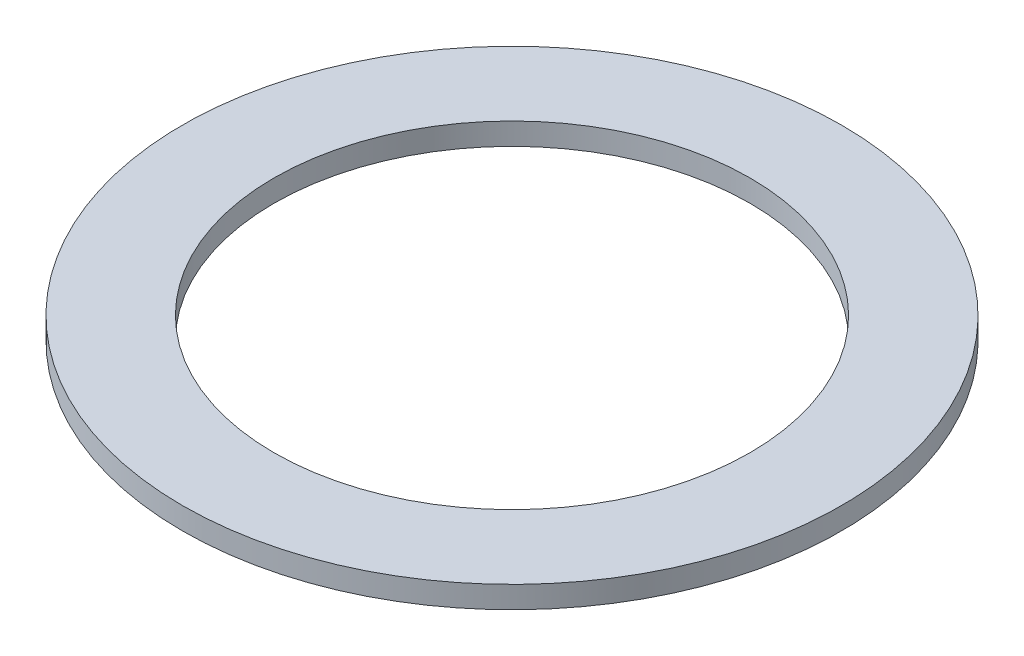
ISO-10303-21;
HEADER;
FILE_DESCRIPTION(('STEP AP214'),'2;1');
FILE_NAME('part.step','',(''),(''),'','','');
FILE_SCHEMA(('AUTOMOTIVE_DESIGN { 1 0 10303 214 1 1 1 1 }'));
ENDSEC;
DATA;
#1=APPLICATION_CONTEXT('core data for automotive mechanical design processes');
#2=APPLICATION_PROTOCOL_DEFINITION('international standard','automotive_design',2000,#1);
#3=PRODUCT_CONTEXT('',#1,'mechanical');
#4=PRODUCT('Part','Part','',(#3));
#5=PRODUCT_RELATED_PRODUCT_CATEGORY('part','',(#4));
#6=PRODUCT_DEFINITION_FORMATION('','',#4);
#7=PRODUCT_DEFINITION_CONTEXT('part definition',#1,'design');
#8=PRODUCT_DEFINITION('design','',#6,#7);
#9=PRODUCT_DEFINITION_SHAPE('','',#8);
#10=(LENGTH_UNIT() NAMED_UNIT(*) SI_UNIT(.MILLI.,.METRE.));
#11=(NAMED_UNIT(*) PLANE_ANGLE_UNIT() SI_UNIT($,.RADIAN.));
#12=(NAMED_UNIT(*) SI_UNIT($,.STERADIAN.) SOLID_ANGLE_UNIT());
#13=UNCERTAINTY_MEASURE_WITH_UNIT(LENGTH_MEASURE(1.E-05),#10,'distance_accuracy_value','');
#14=(GEOMETRIC_REPRESENTATION_CONTEXT(3) GLOBAL_UNCERTAINTY_ASSIGNED_CONTEXT((#13)) GLOBAL_UNIT_ASSIGNED_CONTEXT((#10,
#11,#12)) REPRESENTATION_CONTEXT('',''));
#15=CARTESIAN_POINT('',(0.,0.,0.));
#16=DIRECTION('',(0.,0.,1.));
#17=DIRECTION('',(1.,0.,0.));
#18=AXIS2_PLACEMENT_3D('',#15,#16,#17);
#19=CARTESIAN_POINT('',(0.,3.,0.));
#20=DIRECTION('',(0.,1.,0.));
#21=DIRECTION('',(0.,0.,1.));
#22=AXIS2_PLACEMENT_3D('',#19,#20,#21);
#23=PLANE('',#22);
#24=CARTESIAN_POINT('',(0.,3.,0.));
#25=DIRECTION('',(0.,1.,0.));
#26=DIRECTION('',(0.,0.,1.));
#27=AXIS2_PLACEMENT_3D('',#24,#25,#26);
#28=CIRCLE('',#27,45.);
#29=CARTESIAN_POINT('',(0.,3.,45.));
#30=VERTEX_POINT('',#29);
#31=EDGE_CURVE('E10',#30,#30,#28,.T.);
#32=ORIENTED_EDGE('',*,*,#31,.T.);
#33=EDGE_LOOP('',(#32));
#34=FACE_BOUND('',#33,.T.);
#35=CARTESIAN_POINT('',(0.,3.,0.));
#36=DIRECTION('',(0.,1.,0.));
#37=DIRECTION('',(0.,0.,1.));
#38=AXIS2_PLACEMENT_3D('',#35,#36,#37);
#39=CIRCLE('',#38,32.5);
#40=CARTESIAN_POINT('',(0.,3.,32.5));
#41=VERTEX_POINT('',#40);
#42=EDGE_CURVE('E42',#41,#41,#39,.T.);
#43=ORIENTED_EDGE('',*,*,#42,.F.);
#44=EDGE_LOOP('',(#43));
#45=FACE_BOUND('',#44,.T.);
#46=ADVANCED_FACE('F31',(#34,#45),#23,.T.);
#47=CARTESIAN_POINT('',(0.,0.,0.));
#48=DIRECTION('',(0.,1.,0.));
#49=DIRECTION('',(0.,0.,1.));
#50=AXIS2_PLACEMENT_3D('',#47,#48,#49);
#51=PLANE('',#50);
#52=CARTESIAN_POINT('',(0.,0.,0.));
#53=DIRECTION('',(0.,1.,0.));
#54=DIRECTION('',(0.,0.,1.));
#55=AXIS2_PLACEMENT_3D('',#52,#53,#54);
#56=CIRCLE('',#55,45.);
#57=CARTESIAN_POINT('',(0.,0.,45.));
#58=VERTEX_POINT('',#57);
#59=EDGE_CURVE('E35',#58,#58,#56,.T.);
#60=ORIENTED_EDGE('',*,*,#59,.F.);
#61=EDGE_LOOP('',(#60));
#62=FACE_BOUND('',#61,.T.);
#63=CARTESIAN_POINT('',(0.,0.,0.));
#64=DIRECTION('',(0.,1.,0.));
#65=DIRECTION('',(0.,0.,1.));
#66=AXIS2_PLACEMENT_3D('',#63,#64,#65);
#67=CIRCLE('',#66,32.5);
#68=CARTESIAN_POINT('',(0.,0.,32.5));
#69=VERTEX_POINT('',#68);
#70=EDGE_CURVE('E44',#69,#69,#67,.T.);
#71=ORIENTED_EDGE('',*,*,#70,.T.);
#72=EDGE_LOOP('',(#71));
#73=FACE_BOUND('',#72,.T.);
#74=ADVANCED_FACE('F54',(#62,#73),#51,.F.);
#75=CARTESIAN_POINT('',(0.,3.,0.));
#76=DIRECTION('',(0.,-1.,0.));
#77=DIRECTION('',(0.,0.,-1.));
#78=AXIS2_PLACEMENT_3D('',#75,#76,#77);
#79=CYLINDRICAL_SURFACE('',#78,45.);
#80=ORIENTED_EDGE('',*,*,#31,.F.);
#81=EDGE_LOOP('',(#80));
#82=FACE_BOUND('',#81,.T.);
#83=ORIENTED_EDGE('',*,*,#59,.T.);
#84=EDGE_LOOP('',(#83));
#85=FACE_BOUND('',#84,.T.);
#86=ADVANCED_FACE('F33',(#82,#85),#79,.T.);
#87=CARTESIAN_POINT('',(0.,3.,0.));
#88=DIRECTION('',(0.,-1.,0.));
#89=DIRECTION('',(0.,0.,-1.));
#90=AXIS2_PLACEMENT_3D('',#87,#88,#89);
#91=CYLINDRICAL_SURFACE('',#90,32.5);
#92=ORIENTED_EDGE('',*,*,#42,.T.);
#93=EDGE_LOOP('',(#92));
#94=FACE_BOUND('',#93,.T.);
#95=ORIENTED_EDGE('',*,*,#70,.F.);
#96=EDGE_LOOP('',(#95));
#97=FACE_BOUND('',#96,.T.);
#98=ADVANCED_FACE('F50',(#94,#97),#91,.F.);
#99=CLOSED_SHELL('',(#46,#74,#86,#98));
#100=MANIFOLD_SOLID_BREP('B2',#99);
#101=ADVANCED_BREP_SHAPE_REPRESENTATION('',(#18,#100),#14);
#102=SHAPE_DEFINITION_REPRESENTATION(#9,#101);
ENDSEC;
END-ISO-10303-21;
